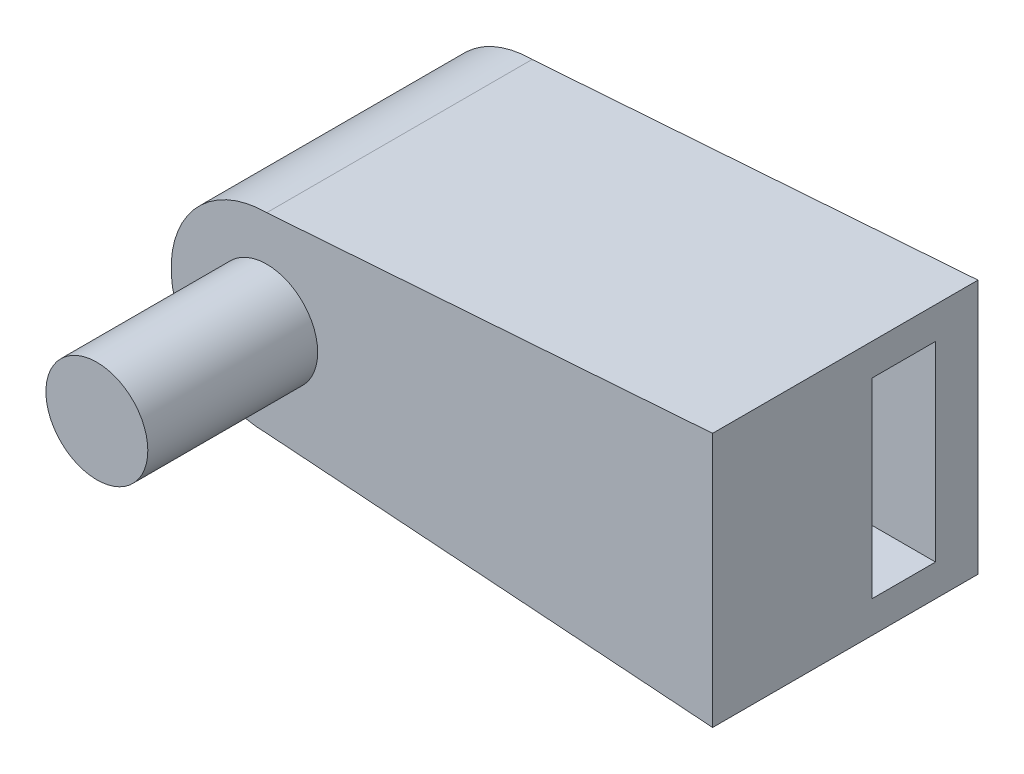
ISO-10303-21;
HEADER;
FILE_DESCRIPTION(('STEP AP214'),'2;1');
FILE_NAME('part.step','',(''),(''),'','','');
FILE_SCHEMA(('AUTOMOTIVE_DESIGN { 1 0 10303 214 1 1 1 1 }'));
ENDSEC;
DATA;
#1=APPLICATION_CONTEXT('core data for automotive mechanical design processes');
#2=APPLICATION_PROTOCOL_DEFINITION('international standard','automotive_design',2000,#1);
#3=PRODUCT_CONTEXT('',#1,'mechanical');
#4=PRODUCT('Part','Part','',(#3));
#5=PRODUCT_RELATED_PRODUCT_CATEGORY('part','',(#4));
#6=PRODUCT_DEFINITION_FORMATION('','',#4);
#7=PRODUCT_DEFINITION_CONTEXT('part definition',#1,'design');
#8=PRODUCT_DEFINITION('design','',#6,#7);
#9=PRODUCT_DEFINITION_SHAPE('','',#8);
#10=(LENGTH_UNIT() NAMED_UNIT(*) SI_UNIT(.MILLI.,.METRE.));
#11=(NAMED_UNIT(*) PLANE_ANGLE_UNIT() SI_UNIT($,.RADIAN.));
#12=(NAMED_UNIT(*) SI_UNIT($,.STERADIAN.) SOLID_ANGLE_UNIT());
#13=UNCERTAINTY_MEASURE_WITH_UNIT(LENGTH_MEASURE(1.E-05),#10,'distance_accuracy_value','');
#14=(GEOMETRIC_REPRESENTATION_CONTEXT(3) GLOBAL_UNCERTAINTY_ASSIGNED_CONTEXT((#13)) GLOBAL_UNIT_ASSIGNED_CONTEXT((#10,
#11,#12)) REPRESENTATION_CONTEXT('',''));
#15=CARTESIAN_POINT('',(0.,0.,0.));
#16=DIRECTION('',(0.,0.,1.));
#17=DIRECTION('',(1.,0.,0.));
#18=AXIS2_PLACEMENT_3D('',#15,#16,#17);
#19=CARTESIAN_POINT('',(-15.,6.,3.));
#20=DIRECTION('',(0.,0.,-1.));
#21=DIRECTION('',(-1.,0.,0.));
#22=AXIS2_PLACEMENT_3D('',#19,#20,#21);
#23=CYLINDRICAL_SURFACE('',#22,3.);
#24=CARTESIAN_POINT('',(-15.,6.,0.));
#25=DIRECTION('',(0.,0.,1.));
#26=DIRECTION('',(1.,0.,0.));
#27=AXIS2_PLACEMENT_3D('',#24,#25,#26);
#28=CIRCLE('',#27,3.);
#29=CARTESIAN_POINT('',(-15.,9.,0.));
#30=VERTEX_POINT('',#29);
#31=CARTESIAN_POINT('',(-15.,3.,0.));
#32=VERTEX_POINT('',#31);
#33=EDGE_CURVE('E156',#30,#32,#28,.T.);
#34=ORIENTED_EDGE('',*,*,#33,.F.);
#35=DIRECTION('',(0.,0.,-1.));
#36=VECTOR('',#35,1.);
#37=CARTESIAN_POINT('',(-15.,9.,3.));
#38=LINE('',#37,#36);
#39=CARTESIAN_POINT('',(-15.,9.,3.));
#40=VERTEX_POINT('',#39);
#41=EDGE_CURVE('E48',#40,#30,#38,.T.);
#42=ORIENTED_EDGE('',*,*,#41,.F.);
#43=CARTESIAN_POINT('',(-15.,6.,3.));
#44=DIRECTION('',(0.,0.,1.));
#45=DIRECTION('',(1.,0.,0.));
#46=AXIS2_PLACEMENT_3D('',#43,#44,#45);
#47=CIRCLE('',#46,3.);
#48=CARTESIAN_POINT('',(-15.,3.,3.));
#49=VERTEX_POINT('',#48);
#50=EDGE_CURVE('E157',#40,#49,#47,.T.);
#51=ORIENTED_EDGE('',*,*,#50,.T.);
#52=DIRECTION('',(0.,0.,-1.));
#53=VECTOR('',#52,1.);
#54=CARTESIAN_POINT('',(-15.,3.,3.));
#55=LINE('',#54,#53);
#56=EDGE_CURVE('E45',#49,#32,#55,.T.);
#57=ORIENTED_EDGE('',*,*,#56,.T.);
#58=EDGE_LOOP('',(#34,#42,#51,#57));
#59=FACE_BOUND('',#58,.T.);
#60=ADVANCED_FACE('F39',(#59),#23,.F.);
#61=CARTESIAN_POINT('',(-15.,9.,3.));
#62=DIRECTION('',(-0.148340452930245,0.988936352868298,0.));
#63=DIRECTION('',(-0.988936352868298,-0.148340452930245,0.));
#64=AXIS2_PLACEMENT_3D('',#61,#62,#63);
#65=PLANE('',#64);
#66=DIRECTION('',(0.988936352868298,0.148340452930245,0.));
#67=VECTOR('',#66,1.);
#68=CARTESIAN_POINT('',(-15.,9.,0.));
#69=LINE('',#68,#67);
#70=CARTESIAN_POINT('',(-5.,10.5,0.));
#71=VERTEX_POINT('',#70);
#72=EDGE_CURVE('E165',#30,#71,#69,.T.);
#73=ORIENTED_EDGE('',*,*,#72,.T.);
#74=DIRECTION('',(0.,0.,-1.));
#75=VECTOR('',#74,1.);
#76=CARTESIAN_POINT('',(-5.,10.5,3.));
#77=LINE('',#76,#75);
#78=CARTESIAN_POINT('',(-5.,10.5,3.));
#79=VERTEX_POINT('',#78);
#80=EDGE_CURVE('E189',#79,#71,#77,.T.);
#81=ORIENTED_EDGE('',*,*,#80,.F.);
#82=DIRECTION('',(0.988936352868298,0.148340452930245,0.));
#83=VECTOR('',#82,1.);
#84=CARTESIAN_POINT('',(-15.,9.,3.));
#85=LINE('',#84,#83);
#86=EDGE_CURVE('E172',#40,#79,#85,.T.);
#87=ORIENTED_EDGE('',*,*,#86,.F.);
#88=ORIENTED_EDGE('',*,*,#41,.T.);
#89=EDGE_LOOP('',(#73,#81,#87,#88));
#90=FACE_BOUND('',#89,.T.);
#91=ADVANCED_FACE('F222',(#90),#65,.F.);
#92=CARTESIAN_POINT('',(0.,10.5,3.));
#93=DIRECTION('',(0.,-1.,0.));
#94=DIRECTION('',(0.,0.,-1.));
#95=AXIS2_PLACEMENT_3D('',#92,#93,#94);
#96=PLANE('',#95);
#97=DIRECTION('',(-1.,0.,0.));
#98=VECTOR('',#97,1.);
#99=CARTESIAN_POINT('',(0.,10.5,0.));
#100=LINE('',#99,#98);
#101=CARTESIAN_POINT('',(0.,10.5,0.));
#102=VERTEX_POINT('',#101);
#103=EDGE_CURVE('E182',#102,#71,#100,.T.);
#104=ORIENTED_EDGE('',*,*,#103,.F.);
#105=DIRECTION('',(0.,0.,-1.));
#106=VECTOR('',#105,1.);
#107=CARTESIAN_POINT('',(0.,10.5,3.));
#108=LINE('',#107,#106);
#109=CARTESIAN_POINT('',(0.,10.5,3.));
#110=VERTEX_POINT('',#109);
#111=EDGE_CURVE('E188',#110,#102,#108,.T.);
#112=ORIENTED_EDGE('',*,*,#111,.F.);
#113=DIRECTION('',(-1.,0.,0.));
#114=VECTOR('',#113,1.);
#115=CARTESIAN_POINT('',(0.,10.5,3.));
#116=LINE('',#115,#114);
#117=EDGE_CURVE('E169',#110,#79,#116,.T.);
#118=ORIENTED_EDGE('',*,*,#117,.T.);
#119=ORIENTED_EDGE('',*,*,#80,.T.);
#120=EDGE_LOOP('',(#104,#112,#118,#119));
#121=FACE_BOUND('',#120,.T.);
#122=ADVANCED_FACE('F217',(#121),#96,.T.);
#123=CARTESIAN_POINT('',(0.,10.5,3.));
#124=DIRECTION('',(-1.,0.,0.));
#125=DIRECTION('',(0.,0.,1.));
#126=AXIS2_PLACEMENT_3D('',#123,#124,#125);
#127=PLANE('',#126);
#128=DIRECTION('',(0.,-1.,0.));
#129=VECTOR('',#128,1.);
#130=CARTESIAN_POINT('',(0.,0.,0.));
#131=LINE('',#130,#129);
#132=CARTESIAN_POINT('',(0.,1.5,0.));
#133=VERTEX_POINT('',#132);
#134=EDGE_CURVE('E140',#102,#133,#131,.T.);
#135=ORIENTED_EDGE('',*,*,#134,.T.);
#136=DIRECTION('',(0.,0.,-1.));
#137=VECTOR('',#136,1.);
#138=CARTESIAN_POINT('',(0.,1.5,3.));
#139=LINE('',#138,#137);
#140=CARTESIAN_POINT('',(0.,1.5,3.));
#141=VERTEX_POINT('',#140);
#142=EDGE_CURVE('E197',#141,#133,#139,.T.);
#143=ORIENTED_EDGE('',*,*,#142,.F.);
#144=DIRECTION('',(0.,1.,0.));
#145=VECTOR('',#144,1.);
#146=CARTESIAN_POINT('',(0.,0.,3.));
#147=LINE('',#146,#145);
#148=EDGE_CURVE('E144',#141,#110,#147,.T.);
#149=ORIENTED_EDGE('',*,*,#148,.T.);
#150=ORIENTED_EDGE('',*,*,#111,.T.);
#151=EDGE_LOOP('',(#135,#143,#149,#150));
#152=FACE_BOUND('',#151,.T.);
#153=DIRECTION('',(0.,0.,-1.));
#154=VECTOR('',#153,1.);
#155=CARTESIAN_POINT('',(0.,0.,3.));
#156=LINE('',#155,#154);
#157=CARTESIAN_POINT('',(0.,0.,10.5));
#158=VERTEX_POINT('',#157);
#159=CARTESIAN_POINT('',(0.,0.,-2.));
#160=VERTEX_POINT('',#159);
#161=EDGE_CURVE('E124',#158,#160,#156,.T.);
#162=ORIENTED_EDGE('',*,*,#161,.T.);
#163=DIRECTION('',(0.,-1.,0.));
#164=VECTOR('',#163,1.);
#165=CARTESIAN_POINT('',(0.,0.,-2.));
#166=LINE('',#165,#164);
#167=CARTESIAN_POINT('',(0.,12.,-2.));
#168=VERTEX_POINT('',#167);
#169=EDGE_CURVE('E137',#168,#160,#166,.T.);
#170=ORIENTED_EDGE('',*,*,#169,.F.);
#171=DIRECTION('',(0.,0.,-1.));
#172=VECTOR('',#171,1.);
#173=CARTESIAN_POINT('',(0.,12.,3.));
#174=LINE('',#173,#172);
#175=CARTESIAN_POINT('',(0.,12.,10.5));
#176=VERTEX_POINT('',#175);
#177=EDGE_CURVE('E194',#176,#168,#174,.T.);
#178=ORIENTED_EDGE('',*,*,#177,.F.);
#179=DIRECTION('',(0.,1.,0.));
#180=VECTOR('',#179,1.);
#181=CARTESIAN_POINT('',(0.,0.,10.5));
#182=LINE('',#181,#180);
#183=EDGE_CURVE('E146',#158,#176,#182,.T.);
#184=ORIENTED_EDGE('',*,*,#183,.F.);
#185=EDGE_LOOP('',(#162,#170,#178,#184));
#186=FACE_BOUND('',#185,.T.);
#187=ADVANCED_FACE('F212',(#152,#186),#127,.F.);
#188=CARTESIAN_POINT('',(-21.,10.5,3.));
#189=DIRECTION('',(-0.0712470499879097,0.997458699830735,0.));
#190=DIRECTION('',(-0.997458699830735,-0.0712470499879097,0.));
#191=AXIS2_PLACEMENT_3D('',#188,#189,#190);
#192=PLANE('',#191);
#193=ORIENTED_EDGE('',*,*,#177,.T.);
#194=DIRECTION('',(0.997458699830735,0.0712470499879099,0.));
#195=VECTOR('',#194,1.);
#196=CARTESIAN_POINT('',(0.,12.,-2.));
#197=LINE('',#196,#195);
#198=CARTESIAN_POINT('',(-21.,10.5,-2.));
#199=VERTEX_POINT('',#198);
#200=EDGE_CURVE('E132',#199,#168,#197,.T.);
#201=ORIENTED_EDGE('',*,*,#200,.F.);
#202=DIRECTION('',(0.,0.,-1.));
#203=VECTOR('',#202,1.);
#204=CARTESIAN_POINT('',(-21.,10.5,3.));
#205=LINE('',#204,#203);
#206=CARTESIAN_POINT('',(-21.,10.5,10.5));
#207=VERTEX_POINT('',#206);
#208=EDGE_CURVE('E125',#207,#199,#205,.T.);
#209=ORIENTED_EDGE('',*,*,#208,.F.);
#210=DIRECTION('',(-0.997458699830735,-0.0712470499879096,0.));
#211=VECTOR('',#210,1.);
#212=CARTESIAN_POINT('',(0.,12.,10.5));
#213=LINE('',#212,#211);
#214=EDGE_CURVE('E151',#176,#207,#213,.T.);
#215=ORIENTED_EDGE('',*,*,#214,.F.);
#216=EDGE_LOOP('',(#193,#201,#209,#215));
#217=FACE_BOUND('',#216,.T.);
#218=ADVANCED_FACE('F247',(#217),#192,.T.);
#219=CARTESIAN_POINT('',(-21.,6.,3.));
#220=DIRECTION('',(0.,0.,-1.));
#221=DIRECTION('',(-1.,0.,0.));
#222=AXIS2_PLACEMENT_3D('',#219,#220,#221);
#223=CYLINDRICAL_SURFACE('',#222,4.5);
#224=ORIENTED_EDGE('',*,*,#208,.T.);
#225=CARTESIAN_POINT('',(-21.,6.,-2.));
#226=DIRECTION('',(0.,0.,-1.));
#227=DIRECTION('',(-1.,0.,0.));
#228=AXIS2_PLACEMENT_3D('',#225,#226,#227);
#229=CIRCLE('',#228,4.5);
#230=CARTESIAN_POINT('',(-21.,1.5,-2.));
#231=VERTEX_POINT('',#230);
#232=EDGE_CURVE('E127',#231,#199,#229,.T.);
#233=ORIENTED_EDGE('',*,*,#232,.F.);
#234=DIRECTION('',(0.,0.,-1.));
#235=VECTOR('',#234,1.);
#236=CARTESIAN_POINT('',(-21.,1.5,3.));
#237=LINE('',#236,#235);
#238=CARTESIAN_POINT('',(-21.,1.5,10.5));
#239=VERTEX_POINT('',#238);
#240=EDGE_CURVE('E115',#239,#231,#237,.T.);
#241=ORIENTED_EDGE('',*,*,#240,.F.);
#242=CARTESIAN_POINT('',(-21.,6.,10.5));
#243=DIRECTION('',(0.,0.,1.));
#244=DIRECTION('',(1.,0.,0.));
#245=AXIS2_PLACEMENT_3D('',#242,#243,#244);
#246=CIRCLE('',#245,4.5);
#247=EDGE_CURVE('E152',#207,#239,#246,.T.);
#248=ORIENTED_EDGE('',*,*,#247,.F.);
#249=EDGE_LOOP('',(#224,#233,#241,#248));
#250=FACE_BOUND('',#249,.T.);
#251=ADVANCED_FACE('F130',(#250),#223,.T.);
#252=CARTESIAN_POINT('',(-21.,1.5,3.));
#253=DIRECTION('',(0.0712470499879097,0.997458699830735,0.));
#254=DIRECTION('',(-0.997458699830735,0.0712470499879097,0.));
#255=AXIS2_PLACEMENT_3D('',#252,#253,#254);
#256=PLANE('',#255);
#257=ORIENTED_EDGE('',*,*,#240,.T.);
#258=DIRECTION('',(-0.997458699830735,0.0712470499879097,0.));
#259=VECTOR('',#258,1.);
#260=CARTESIAN_POINT('',(0.,0.,-2.));
#261=LINE('',#260,#259);
#262=EDGE_CURVE('E117',#160,#231,#261,.T.);
#263=ORIENTED_EDGE('',*,*,#262,.F.);
#264=ORIENTED_EDGE('',*,*,#161,.F.);
#265=DIRECTION('',(0.997458699830735,-0.0712470499879097,0.));
#266=VECTOR('',#265,1.);
#267=CARTESIAN_POINT('',(0.,0.,10.5));
#268=LINE('',#267,#266);
#269=EDGE_CURVE('E120',#239,#158,#268,.T.);
#270=ORIENTED_EDGE('',*,*,#269,.F.);
#271=EDGE_LOOP('',(#257,#263,#264,#270));
#272=FACE_BOUND('',#271,.T.);
#273=ADVANCED_FACE('F111',(#272),#256,.F.);
#274=CARTESIAN_POINT('',(0.,1.5,3.));
#275=DIRECTION('',(0.,-1.,0.));
#276=DIRECTION('',(0.,0.,-1.));
#277=AXIS2_PLACEMENT_3D('',#274,#275,#276);
#278=PLANE('',#277);
#279=DIRECTION('',(-1.,0.,0.));
#280=VECTOR('',#279,1.);
#281=CARTESIAN_POINT('',(0.,1.5,0.));
#282=LINE('',#281,#280);
#283=CARTESIAN_POINT('',(-5.,1.5,0.));
#284=VERTEX_POINT('',#283);
#285=EDGE_CURVE('E179',#133,#284,#282,.T.);
#286=ORIENTED_EDGE('',*,*,#285,.T.);
#287=DIRECTION('',(0.,0.,-1.));
#288=VECTOR('',#287,1.);
#289=CARTESIAN_POINT('',(-5.,1.5,3.));
#290=LINE('',#289,#288);
#291=CARTESIAN_POINT('',(-5.,1.5,3.));
#292=VERTEX_POINT('',#291);
#293=EDGE_CURVE('E200',#292,#284,#290,.T.);
#294=ORIENTED_EDGE('',*,*,#293,.F.);
#295=DIRECTION('',(-1.,0.,0.));
#296=VECTOR('',#295,1.);
#297=CARTESIAN_POINT('',(0.,1.5,3.));
#298=LINE('',#297,#296);
#299=EDGE_CURVE('E164',#141,#292,#298,.T.);
#300=ORIENTED_EDGE('',*,*,#299,.F.);
#301=ORIENTED_EDGE('',*,*,#142,.T.);
#302=EDGE_LOOP('',(#286,#294,#300,#301));
#303=FACE_BOUND('',#302,.T.);
#304=ADVANCED_FACE('F209',(#303),#278,.F.);
#305=CARTESIAN_POINT('',(-5.,1.5,3.));
#306=DIRECTION('',(-0.148340452930245,-0.988936352868298,0.));
#307=DIRECTION('',(0.988936352868298,-0.148340452930245,0.));
#308=AXIS2_PLACEMENT_3D('',#305,#306,#307);
#309=PLANE('',#308);
#310=DIRECTION('',(-0.988936352868298,0.148340452930245,0.));
#311=VECTOR('',#310,1.);
#312=CARTESIAN_POINT('',(-5.,1.5,0.));
#313=LINE('',#312,#311);
#314=EDGE_CURVE('E173',#284,#32,#313,.T.);
#315=ORIENTED_EDGE('',*,*,#314,.T.);
#316=ORIENTED_EDGE('',*,*,#56,.F.);
#317=DIRECTION('',(-0.988936352868298,0.148340452930245,0.));
#318=VECTOR('',#317,1.);
#319=CARTESIAN_POINT('',(-5.,1.5,3.));
#320=LINE('',#319,#318);
#321=EDGE_CURVE('E161',#292,#49,#320,.T.);
#322=ORIENTED_EDGE('',*,*,#321,.F.);
#323=ORIENTED_EDGE('',*,*,#293,.T.);
#324=EDGE_LOOP('',(#315,#316,#322,#323));
#325=FACE_BOUND('',#324,.T.);
#326=ADVANCED_FACE('F206',(#325),#309,.F.);
#327=CARTESIAN_POINT('',(-21.,6.,10.5));
#328=DIRECTION('',(0.,0.,1.));
#329=DIRECTION('',(1.,0.,0.));
#330=AXIS2_PLACEMENT_3D('',#327,#328,#329);
#331=PLANE('',#330);
#332=CARTESIAN_POINT('',(-21.,6.,10.5));
#333=DIRECTION('',(0.,0.,1.));
#334=DIRECTION('',(1.,0.,0.));
#335=AXIS2_PLACEMENT_3D('',#332,#333,#334);
#336=CIRCLE('',#335,2.4);
#337=CARTESIAN_POINT('',(-18.6,6.,10.5));
#338=VERTEX_POINT('',#337);
#339=EDGE_CURVE('E11',#338,#338,#336,.T.);
#340=ORIENTED_EDGE('',*,*,#339,.F.);
#341=EDGE_LOOP('',(#340));
#342=FACE_BOUND('',#341,.T.);
#343=ORIENTED_EDGE('',*,*,#269,.T.);
#344=ORIENTED_EDGE('',*,*,#183,.T.);
#345=ORIENTED_EDGE('',*,*,#214,.T.);
#346=ORIENTED_EDGE('',*,*,#247,.T.);
#347=EDGE_LOOP('',(#343,#344,#345,#346));
#348=FACE_BOUND('',#347,.T.);
#349=ADVANCED_FACE('F223',(#342,#348),#331,.T.);
#350=CARTESIAN_POINT('',(-21.,6.,3.));
#351=DIRECTION('',(0.,0.,1.));
#352=DIRECTION('',(1.,0.,0.));
#353=AXIS2_PLACEMENT_3D('',#350,#351,#352);
#354=PLANE('',#353);
#355=ORIENTED_EDGE('',*,*,#117,.F.);
#356=ORIENTED_EDGE('',*,*,#148,.F.);
#357=ORIENTED_EDGE('',*,*,#299,.T.);
#358=ORIENTED_EDGE('',*,*,#321,.T.);
#359=ORIENTED_EDGE('',*,*,#50,.F.);
#360=ORIENTED_EDGE('',*,*,#86,.T.);
#361=EDGE_LOOP('',(#355,#356,#357,#358,#359,#360));
#362=FACE_BOUND('',#361,.T.);
#363=ADVANCED_FACE('F224',(#362),#354,.F.);
#364=CARTESIAN_POINT('',(-21.,6.,-2.));
#365=DIRECTION('',(0.,0.,-1.));
#366=DIRECTION('',(-1.,0.,0.));
#367=AXIS2_PLACEMENT_3D('',#364,#365,#366);
#368=PLANE('',#367);
#369=ORIENTED_EDGE('',*,*,#262,.T.);
#370=ORIENTED_EDGE('',*,*,#232,.T.);
#371=ORIENTED_EDGE('',*,*,#200,.T.);
#372=ORIENTED_EDGE('',*,*,#169,.T.);
#373=EDGE_LOOP('',(#369,#370,#371,#372));
#374=FACE_BOUND('',#373,.T.);
#375=ADVANCED_FACE('F131',(#374),#368,.T.);
#376=CARTESIAN_POINT('',(-21.,6.,0.));
#377=DIRECTION('',(0.,0.,-1.));
#378=DIRECTION('',(-1.,0.,0.));
#379=AXIS2_PLACEMENT_3D('',#376,#377,#378);
#380=PLANE('',#379);
#381=ORIENTED_EDGE('',*,*,#285,.F.);
#382=ORIENTED_EDGE('',*,*,#134,.F.);
#383=ORIENTED_EDGE('',*,*,#103,.T.);
#384=ORIENTED_EDGE('',*,*,#72,.F.);
#385=ORIENTED_EDGE('',*,*,#33,.T.);
#386=ORIENTED_EDGE('',*,*,#314,.F.);
#387=EDGE_LOOP('',(#381,#382,#383,#384,#385,#386));
#388=FACE_BOUND('',#387,.T.);
#389=ADVANCED_FACE('F208',(#388),#380,.F.);
#390=CARTESIAN_POINT('',(-21.,6.,18.5));
#391=DIRECTION('',(0.,0.,-1.));
#392=DIRECTION('',(-1.,0.,0.));
#393=AXIS2_PLACEMENT_3D('',#390,#391,#392);
#394=CYLINDRICAL_SURFACE('',#393,2.4);
#395=CARTESIAN_POINT('',(-21.,6.,18.5));
#396=DIRECTION('',(0.,0.,1.));
#397=DIRECTION('',(1.,0.,0.));
#398=AXIS2_PLACEMENT_3D('',#395,#396,#397);
#399=CIRCLE('',#398,2.4);
#400=CARTESIAN_POINT('',(-18.6,6.,18.5));
#401=VERTEX_POINT('',#400);
#402=EDGE_CURVE('E138',#401,#401,#399,.T.);
#403=ORIENTED_EDGE('',*,*,#402,.F.);
#404=EDGE_LOOP('',(#403));
#405=FACE_BOUND('',#404,.T.);
#406=ORIENTED_EDGE('',*,*,#339,.T.);
#407=EDGE_LOOP('',(#406));
#408=FACE_BOUND('',#407,.T.);
#409=ADVANCED_FACE('F272',(#405,#408),#394,.T.);
#410=CARTESIAN_POINT('',(-21.,6.,18.5));
#411=DIRECTION('',(0.,0.,1.));
#412=DIRECTION('',(1.,0.,0.));
#413=AXIS2_PLACEMENT_3D('',#410,#411,#412);
#414=PLANE('',#413);
#415=ORIENTED_EDGE('',*,*,#402,.T.);
#416=EDGE_LOOP('',(#415));
#417=FACE_BOUND('',#416,.T.);
#418=ADVANCED_FACE('F289',(#417),#414,.T.);
#419=CLOSED_SHELL('',(#60,#91,#122,#187,#218,#251,#273,#304,#326,#349,#363,#375,#389,#409,#418));
#420=MANIFOLD_SOLID_BREP('B2',#419);
#421=ADVANCED_BREP_SHAPE_REPRESENTATION('',(#18,#420),#14);
#422=SHAPE_DEFINITION_REPRESENTATION(#9,#421);
ENDSEC;
END-ISO-10303-21;
